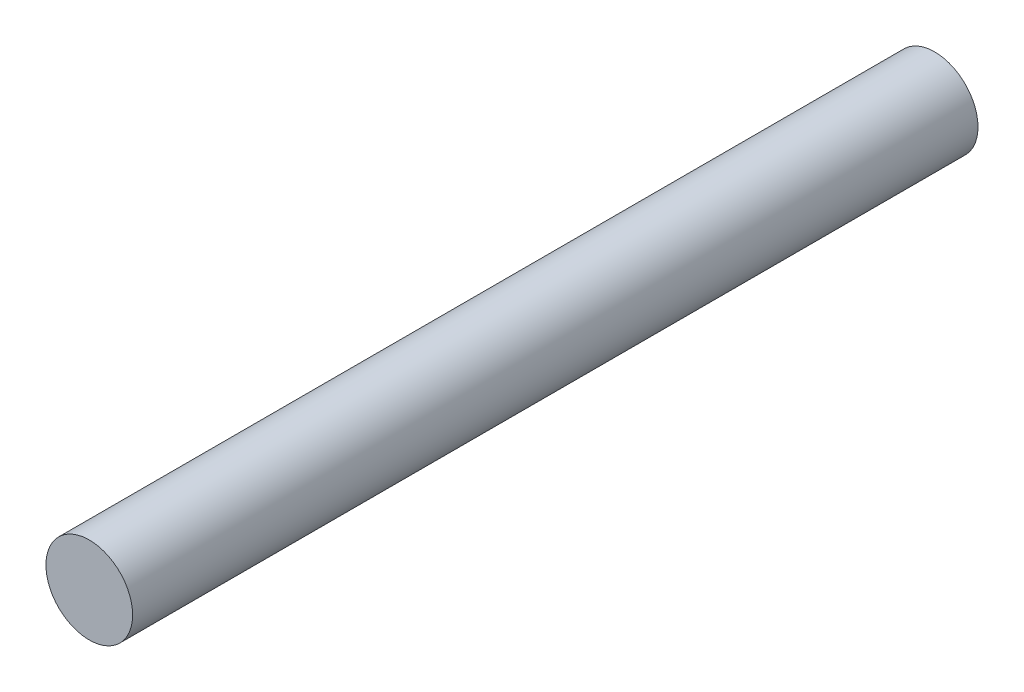
ISO-10303-21;
HEADER;
FILE_DESCRIPTION(('STEP AP214'),'2;1');
FILE_NAME('part.step','',(''),(''),'','','');
FILE_SCHEMA(('AUTOMOTIVE_DESIGN { 1 0 10303 214 1 1 1 1 }'));
ENDSEC;
DATA;
#1=APPLICATION_CONTEXT('core data for automotive mechanical design processes');
#2=APPLICATION_PROTOCOL_DEFINITION('international standard','automotive_design',2000,#1);
#3=PRODUCT_CONTEXT('',#1,'mechanical');
#4=PRODUCT('Part','Part','',(#3));
#5=PRODUCT_RELATED_PRODUCT_CATEGORY('part','',(#4));
#6=PRODUCT_DEFINITION_FORMATION('','',#4);
#7=PRODUCT_DEFINITION_CONTEXT('part definition',#1,'design');
#8=PRODUCT_DEFINITION('design','',#6,#7);
#9=PRODUCT_DEFINITION_SHAPE('','',#8);
#10=(LENGTH_UNIT() NAMED_UNIT(*) SI_UNIT(.MILLI.,.METRE.));
#11=(NAMED_UNIT(*) PLANE_ANGLE_UNIT() SI_UNIT($,.RADIAN.));
#12=(NAMED_UNIT(*) SI_UNIT($,.STERADIAN.) SOLID_ANGLE_UNIT());
#13=UNCERTAINTY_MEASURE_WITH_UNIT(LENGTH_MEASURE(1.E-05),#10,'distance_accuracy_value','');
#14=(GEOMETRIC_REPRESENTATION_CONTEXT(3) GLOBAL_UNCERTAINTY_ASSIGNED_CONTEXT((#13)) GLOBAL_UNIT_ASSIGNED_CONTEXT((#10,
#11,#12)) REPRESENTATION_CONTEXT('',''));
#15=CARTESIAN_POINT('',(0.,0.,0.));
#16=DIRECTION('',(0.,0.,1.));
#17=DIRECTION('',(1.,0.,0.));
#18=AXIS2_PLACEMENT_3D('',#15,#16,#17);
#19=CARTESIAN_POINT('',(0.,0.,78.));
#20=DIRECTION('',(0.,0.,-1.));
#21=DIRECTION('',(-1.,0.,0.));
#22=AXIS2_PLACEMENT_3D('',#19,#20,#21);
#23=CYLINDRICAL_SURFACE('',#22,4.);
#24=CARTESIAN_POINT('',(0.,0.,78.));
#25=DIRECTION('',(0.,0.,1.));
#26=DIRECTION('',(1.,0.,0.));
#27=AXIS2_PLACEMENT_3D('',#24,#25,#26);
#28=CIRCLE('',#27,4.);
#29=CARTESIAN_POINT('',(4.,0.,78.));
#30=VERTEX_POINT('',#29);
#31=EDGE_CURVE('E10',#30,#30,#28,.T.);
#32=ORIENTED_EDGE('',*,*,#31,.F.);
#33=EDGE_LOOP('',(#32));
#34=FACE_BOUND('',#33,.T.);
#35=CARTESIAN_POINT('',(0.,0.,0.));
#36=DIRECTION('',(0.,0.,1.));
#37=DIRECTION('',(1.,0.,0.));
#38=AXIS2_PLACEMENT_3D('',#35,#36,#37);
#39=CIRCLE('',#38,4.);
#40=CARTESIAN_POINT('',(4.,0.,0.));
#41=VERTEX_POINT('',#40);
#42=EDGE_CURVE('E37',#41,#41,#39,.T.);
#43=ORIENTED_EDGE('',*,*,#42,.T.);
#44=EDGE_LOOP('',(#43));
#45=FACE_BOUND('',#44,.T.);
#46=ADVANCED_FACE('F34',(#34,#45),#23,.T.);
#47=CARTESIAN_POINT('',(0.,0.,78.));
#48=DIRECTION('',(0.,0.,1.));
#49=DIRECTION('',(1.,0.,0.));
#50=AXIS2_PLACEMENT_3D('',#47,#48,#49);
#51=PLANE('',#50);
#52=ORIENTED_EDGE('',*,*,#31,.T.);
#53=EDGE_LOOP('',(#52));
#54=FACE_BOUND('',#53,.T.);
#55=ADVANCED_FACE('F49',(#54),#51,.T.);
#56=CARTESIAN_POINT('',(0.,0.,0.));
#57=DIRECTION('',(0.,0.,1.));
#58=DIRECTION('',(1.,0.,0.));
#59=AXIS2_PLACEMENT_3D('',#56,#57,#58);
#60=PLANE('',#59);
#61=ORIENTED_EDGE('',*,*,#42,.F.);
#62=EDGE_LOOP('',(#61));
#63=FACE_BOUND('',#62,.T.);
#64=ADVANCED_FACE('F47',(#63),#60,.F.);
#65=CLOSED_SHELL('',(#46,#55,#64));
#66=MANIFOLD_SOLID_BREP('B2',#65);
#67=ADVANCED_BREP_SHAPE_REPRESENTATION('',(#18,#66),#14);
#68=SHAPE_DEFINITION_REPRESENTATION(#9,#67);
ENDSEC;
END-ISO-10303-21;
